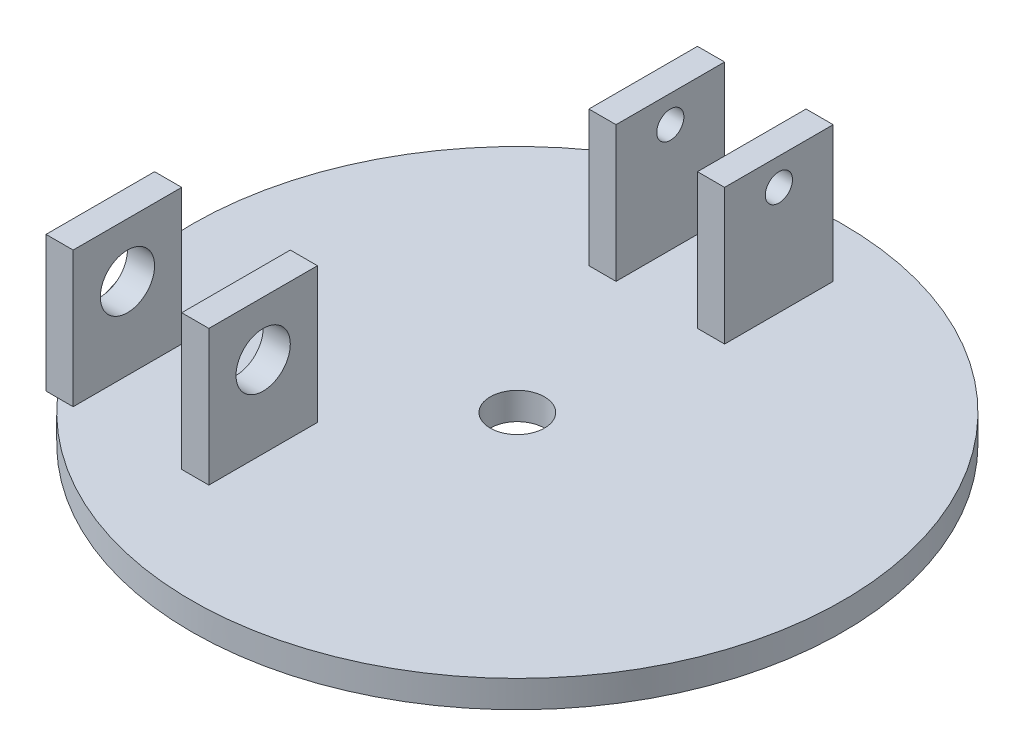
ISO-10303-21;
HEADER;
FILE_DESCRIPTION(('STEP AP214'),'2;1');
FILE_NAME('part.step','',(''),(''),'','','');
FILE_SCHEMA(('AUTOMOTIVE_DESIGN { 1 0 10303 214 1 1 1 1 }'));
ENDSEC;
DATA;
#1=APPLICATION_CONTEXT('core data for automotive mechanical design processes');
#2=APPLICATION_PROTOCOL_DEFINITION('international standard','automotive_design',2000,#1);
#3=PRODUCT_CONTEXT('',#1,'mechanical');
#4=PRODUCT('Part','Part','',(#3));
#5=PRODUCT_RELATED_PRODUCT_CATEGORY('part','',(#4));
#6=PRODUCT_DEFINITION_FORMATION('','',#4);
#7=PRODUCT_DEFINITION_CONTEXT('part definition',#1,'design');
#8=PRODUCT_DEFINITION('design','',#6,#7);
#9=PRODUCT_DEFINITION_SHAPE('','',#8);
#10=(LENGTH_UNIT() NAMED_UNIT(*) SI_UNIT(.MILLI.,.METRE.));
#11=(NAMED_UNIT(*) PLANE_ANGLE_UNIT() SI_UNIT($,.RADIAN.));
#12=(NAMED_UNIT(*) SI_UNIT($,.STERADIAN.) SOLID_ANGLE_UNIT());
#13=UNCERTAINTY_MEASURE_WITH_UNIT(LENGTH_MEASURE(1.E-05),#10,'distance_accuracy_value','');
#14=(GEOMETRIC_REPRESENTATION_CONTEXT(3) GLOBAL_UNCERTAINTY_ASSIGNED_CONTEXT((#13)) GLOBAL_UNIT_ASSIGNED_CONTEXT((#10,
#11,#12)) REPRESENTATION_CONTEXT('',''));
#15=CARTESIAN_POINT('',(0.,0.,0.));
#16=DIRECTION('',(0.,0.,1.));
#17=DIRECTION('',(1.,0.,0.));
#18=AXIS2_PLACEMENT_3D('',#15,#16,#17);
#19=CARTESIAN_POINT('',(0.,6.35,0.));
#20=DIRECTION('',(0.,1.,0.));
#21=DIRECTION('',(0.,0.,1.));
#22=AXIS2_PLACEMENT_3D('',#19,#20,#21);
#23=PLANE('',#22);
#24=DIRECTION('',(1.,0.,0.));
#25=VECTOR('',#24,1.);
#26=CARTESIAN_POINT('',(-21.36267,6.35,-38.1));
#27=LINE('',#26,#25);
#28=CARTESIAN_POINT('',(-21.36267,6.35,-38.1));
#29=VERTEX_POINT('',#28);
#30=CARTESIAN_POINT('',(-15.01267,6.35,-38.1));
#31=VERTEX_POINT('',#30);
#32=EDGE_CURVE('E184',#29,#31,#27,.T.);
#33=ORIENTED_EDGE('',*,*,#32,.F.);
#34=DIRECTION('',(0.,0.,1.));
#35=VECTOR('',#34,1.);
#36=CARTESIAN_POINT('',(-21.36267,6.35,-38.1));
#37=LINE('',#36,#35);
#38=CARTESIAN_POINT('',(-21.36267,6.35,-63.5));
#39=VERTEX_POINT('',#38);
#40=EDGE_CURVE('E181',#39,#29,#37,.T.);
#41=ORIENTED_EDGE('',*,*,#40,.F.);
#42=DIRECTION('',(-1.,0.,0.));
#43=VECTOR('',#42,1.);
#44=CARTESIAN_POINT('',(-21.36267,6.35,-63.5));
#45=LINE('',#44,#43);
#46=CARTESIAN_POINT('',(-15.01267,6.35,-63.5));
#47=VERTEX_POINT('',#46);
#48=EDGE_CURVE('E193',#47,#39,#45,.T.);
#49=ORIENTED_EDGE('',*,*,#48,.F.);
#50=DIRECTION('',(0.,0.,-1.));
#51=VECTOR('',#50,1.);
#52=CARTESIAN_POINT('',(-15.01267,6.35,-38.1));
#53=LINE('',#52,#51);
#54=EDGE_CURVE('E201',#31,#47,#53,.T.);
#55=ORIENTED_EDGE('',*,*,#54,.F.);
#56=EDGE_LOOP('',(#33,#41,#49,#55));
#57=FACE_BOUND('',#56,.T.);
#58=CARTESIAN_POINT('',(0.,6.35,0.));
#59=DIRECTION('',(0.,-1.,0.));
#60=DIRECTION('',(0.,0.,-1.));
#61=AXIS2_PLACEMENT_3D('',#58,#59,#60);
#62=CIRCLE('',#61,6.35);
#63=CARTESIAN_POINT('',(0.,6.35,-6.35));
#64=VERTEX_POINT('',#63);
#65=EDGE_CURVE('E286',#64,#64,#62,.T.);
#66=ORIENTED_EDGE('',*,*,#65,.T.);
#67=EDGE_LOOP('',(#66));
#68=FACE_BOUND('',#67,.T.);
#69=DIRECTION('',(0.,0.,1.));
#70=VECTOR('',#69,1.);
#71=CARTESIAN_POINT('',(-59.46267,6.35,25.4));
#72=LINE('',#71,#70);
#73=CARTESIAN_POINT('',(-59.46267,6.35,25.4));
#74=VERTEX_POINT('',#73);
#75=CARTESIAN_POINT('',(-59.46267,6.35,47.6511372001876));
#76=VERTEX_POINT('',#75);
#77=EDGE_CURVE('E265',#74,#76,#72,.T.);
#78=ORIENTED_EDGE('',*,*,#77,.F.);
#79=DIRECTION('',(-1.,0.,0.));
#80=VECTOR('',#79,1.);
#81=CARTESIAN_POINT('',(-59.46267,6.35,25.4));
#82=LINE('',#81,#80);
#83=CARTESIAN_POINT('',(-53.11267,6.35,25.4));
#84=VERTEX_POINT('',#83);
#85=EDGE_CURVE('E258',#84,#74,#82,.T.);
#86=ORIENTED_EDGE('',*,*,#85,.F.);
#87=DIRECTION('',(0.,0.,-1.));
#88=VECTOR('',#87,1.);
#89=CARTESIAN_POINT('',(-53.11267,6.35,25.4));
#90=LINE('',#89,#88);
#91=CARTESIAN_POINT('',(-53.11267,6.35,50.8));
#92=VERTEX_POINT('',#91);
#93=EDGE_CURVE('E269',#92,#84,#90,.T.);
#94=ORIENTED_EDGE('',*,*,#93,.F.);
#95=DIRECTION('',(1.,0.,0.));
#96=VECTOR('',#95,1.);
#97=CARTESIAN_POINT('',(-59.46267,6.35,50.8));
#98=LINE('',#97,#96);
#99=CARTESIAN_POINT('',(-56.7961266284947,6.35,50.8));
#100=VERTEX_POINT('',#99);
#101=EDGE_CURVE('E11',#100,#92,#98,.T.);
#102=ORIENTED_EDGE('',*,*,#101,.F.);
#103=CARTESIAN_POINT('',(0.,6.35,0.));
#104=DIRECTION('',(0.,1.,0.));
#105=DIRECTION('',(0.,0.,1.));
#106=AXIS2_PLACEMENT_3D('',#103,#104,#105);
#107=CIRCLE('',#106,76.2);
#108=EDGE_CURVE('E291',#100,#76,#107,.T.);
#109=ORIENTED_EDGE('',*,*,#108,.T.);
#110=EDGE_LOOP('',(#78,#86,#94,#102,#109));
#111=FACE_BOUND('',#110,.T.);
#112=DIRECTION('',(1.,0.,0.));
#113=VECTOR('',#112,1.);
#114=CARTESIAN_POINT('',(-27.71267,6.35,50.8));
#115=LINE('',#114,#113);
#116=CARTESIAN_POINT('',(-27.71267,6.35,50.8));
#117=VERTEX_POINT('',#116);
#118=CARTESIAN_POINT('',(-21.36267,6.35,50.8));
#119=VERTEX_POINT('',#118);
#120=EDGE_CURVE('E238',#117,#119,#115,.T.);
#121=ORIENTED_EDGE('',*,*,#120,.F.);
#122=DIRECTION('',(0.,0.,1.));
#123=VECTOR('',#122,1.);
#124=CARTESIAN_POINT('',(-27.71267,6.35,25.4));
#125=LINE('',#124,#123);
#126=CARTESIAN_POINT('',(-27.71267,6.35,25.4));
#127=VERTEX_POINT('',#126);
#128=EDGE_CURVE('E224',#127,#117,#125,.T.);
#129=ORIENTED_EDGE('',*,*,#128,.F.);
#130=DIRECTION('',(-1.,0.,0.));
#131=VECTOR('',#130,1.);
#132=CARTESIAN_POINT('',(-27.71267,6.35,25.4));
#133=LINE('',#132,#131);
#134=CARTESIAN_POINT('',(-21.36267,6.35,25.4));
#135=VERTEX_POINT('',#134);
#136=EDGE_CURVE('E229',#135,#127,#133,.T.);
#137=ORIENTED_EDGE('',*,*,#136,.F.);
#138=DIRECTION('',(0.,0.,-1.));
#139=VECTOR('',#138,1.);
#140=CARTESIAN_POINT('',(-21.36267,6.35,25.4));
#141=LINE('',#140,#139);
#142=EDGE_CURVE('E240',#119,#135,#141,.T.);
#143=ORIENTED_EDGE('',*,*,#142,.F.);
#144=EDGE_LOOP('',(#121,#129,#137,#143));
#145=FACE_BOUND('',#144,.T.);
#146=DIRECTION('',(1.,0.,0.));
#147=VECTOR('',#146,1.);
#148=CARTESIAN_POINT('',(4.03732999999998,6.35,-38.1));
#149=LINE('',#148,#147);
#150=CARTESIAN_POINT('',(4.03732999999998,6.35,-38.1));
#151=VERTEX_POINT('',#150);
#152=CARTESIAN_POINT('',(10.38733,6.35,-38.1));
#153=VERTEX_POINT('',#152);
#154=EDGE_CURVE('E422',#151,#153,#149,.T.);
#155=ORIENTED_EDGE('',*,*,#154,.F.);
#156=DIRECTION('',(0.,0.,1.));
#157=VECTOR('',#156,1.);
#158=CARTESIAN_POINT('',(4.03732999999998,6.35,-63.5));
#159=LINE('',#158,#157);
#160=CARTESIAN_POINT('',(4.03732999999998,6.35,-63.5));
#161=VERTEX_POINT('',#160);
#162=EDGE_CURVE('E179',#161,#151,#159,.T.);
#163=ORIENTED_EDGE('',*,*,#162,.F.);
#164=DIRECTION('',(-1.,0.,0.));
#165=VECTOR('',#164,1.);
#166=CARTESIAN_POINT('',(4.03732999999998,6.35,-63.5));
#167=LINE('',#166,#165);
#168=CARTESIAN_POINT('',(10.38733,6.35,-63.5));
#169=VERTEX_POINT('',#168);
#170=EDGE_CURVE('E175',#169,#161,#167,.T.);
#171=ORIENTED_EDGE('',*,*,#170,.F.);
#172=DIRECTION('',(0.,0.,-1.));
#173=VECTOR('',#172,1.);
#174=CARTESIAN_POINT('',(10.38733,6.35,-63.5));
#175=LINE('',#174,#173);
#176=EDGE_CURVE('E433',#153,#169,#175,.T.);
#177=ORIENTED_EDGE('',*,*,#176,.F.);
#178=EDGE_LOOP('',(#155,#163,#171,#177));
#179=FACE_BOUND('',#178,.T.);
#180=ADVANCED_FACE('F33',(#57,#68,#111,#145,#179),#23,.T.);
#181=CARTESIAN_POINT('',(0.,6.35,0.));
#182=DIRECTION('',(0.,-1.,0.));
#183=DIRECTION('',(0.,0.,-1.));
#184=AXIS2_PLACEMENT_3D('',#181,#182,#183);
#185=CYLINDRICAL_SURFACE('',#184,76.2);
#186=EDGE_CURVE('E42',#76,#100,#107,.T.);
#187=ORIENTED_EDGE('',*,*,#186,.F.);
#188=ORIENTED_EDGE('',*,*,#108,.F.);
#189=EDGE_LOOP('',(#187,#188));
#190=FACE_BOUND('',#189,.T.);
#191=CARTESIAN_POINT('',(0.,0.,0.));
#192=DIRECTION('',(0.,1.,0.));
#193=DIRECTION('',(0.,0.,1.));
#194=AXIS2_PLACEMENT_3D('',#191,#192,#193);
#195=CIRCLE('',#194,76.2);
#196=CARTESIAN_POINT('',(0.,0.,76.2));
#197=VERTEX_POINT('',#196);
#198=EDGE_CURVE('E37',#197,#197,#195,.T.);
#199=ORIENTED_EDGE('',*,*,#198,.T.);
#200=EDGE_LOOP('',(#199));
#201=FACE_BOUND('',#200,.T.);
#202=ADVANCED_FACE('F35',(#190,#201),#185,.T.);
#203=CARTESIAN_POINT('',(0.,0.,0.));
#204=DIRECTION('',(0.,1.,0.));
#205=DIRECTION('',(0.,0.,1.));
#206=AXIS2_PLACEMENT_3D('',#203,#204,#205);
#207=PLANE('',#206);
#208=CARTESIAN_POINT('',(0.,0.,0.));
#209=DIRECTION('',(0.,-1.,0.));
#210=DIRECTION('',(0.,0.,-1.));
#211=AXIS2_PLACEMENT_3D('',#208,#209,#210);
#212=CIRCLE('',#211,6.35);
#213=CARTESIAN_POINT('',(0.,0.,-6.35));
#214=VERTEX_POINT('',#213);
#215=EDGE_CURVE('E285',#214,#214,#212,.T.);
#216=ORIENTED_EDGE('',*,*,#215,.F.);
#217=EDGE_LOOP('',(#216));
#218=FACE_BOUND('',#217,.T.);
#219=ORIENTED_EDGE('',*,*,#198,.F.);
#220=EDGE_LOOP('',(#219));
#221=FACE_BOUND('',#220,.T.);
#222=ADVANCED_FACE('F302',(#218,#221),#207,.F.);
#223=CARTESIAN_POINT('',(0.,6.35,0.));
#224=DIRECTION('',(0.,-1.,0.));
#225=DIRECTION('',(0.,0.,-1.));
#226=AXIS2_PLACEMENT_3D('',#223,#224,#225);
#227=CYLINDRICAL_SURFACE('',#226,6.35);
#228=ORIENTED_EDGE('',*,*,#65,.F.);
#229=EDGE_LOOP('',(#228));
#230=FACE_BOUND('',#229,.T.);
#231=ORIENTED_EDGE('',*,*,#215,.T.);
#232=EDGE_LOOP('',(#231));
#233=FACE_BOUND('',#232,.T.);
#234=ADVANCED_FACE('F304',(#230,#233),#227,.F.);
#235=CARTESIAN_POINT('',(0.,6.35,0.));
#236=DIRECTION('',(0.,1.,0.));
#237=DIRECTION('',(0.,0.,1.));
#238=AXIS2_PLACEMENT_3D('',#235,#236,#237);
#239=PLANE('',#238);
#240=CARTESIAN_POINT('',(-59.46267,6.35,50.8));
#241=VERTEX_POINT('',#240);
#242=EDGE_CURVE('E253',#76,#241,#72,.T.);
#243=ORIENTED_EDGE('',*,*,#242,.F.);
#244=ORIENTED_EDGE('',*,*,#186,.T.);
#245=EDGE_CURVE('E44',#241,#100,#98,.T.);
#246=ORIENTED_EDGE('',*,*,#245,.F.);
#247=EDGE_LOOP('',(#243,#244,#246));
#248=FACE_BOUND('',#247,.T.);
#249=ADVANCED_FACE('F310',(#248),#239,.F.);
#250=CARTESIAN_POINT('',(-59.46267,38.1,25.4));
#251=DIRECTION('',(1.,0.,0.));
#252=DIRECTION('',(0.,0.,-1.));
#253=AXIS2_PLACEMENT_3D('',#250,#251,#252);
#254=PLANE('',#253);
#255=CARTESIAN_POINT('',(-59.46267,25.4,38.1));
#256=DIRECTION('',(1.,0.,0.));
#257=DIRECTION('',(0.,0.,-1.));
#258=AXIS2_PLACEMENT_3D('',#255,#256,#257);
#259=CIRCLE('',#258,6.35);
#260=CARTESIAN_POINT('',(-59.46267,25.4,31.75));
#261=VERTEX_POINT('',#260);
#262=EDGE_CURVE('E215',#261,#261,#259,.F.);
#263=ORIENTED_EDGE('',*,*,#262,.F.);
#264=EDGE_LOOP('',(#263));
#265=FACE_BOUND('',#264,.T.);
#266=ORIENTED_EDGE('',*,*,#77,.T.);
#267=ORIENTED_EDGE('',*,*,#242,.T.);
#268=DIRECTION('',(0.,-1.,0.));
#269=VECTOR('',#268,1.);
#270=CARTESIAN_POINT('',(-59.46267,38.1,50.8));
#271=LINE('',#270,#269);
#272=CARTESIAN_POINT('',(-59.46267,38.1,50.8));
#273=VERTEX_POINT('',#272);
#274=EDGE_CURVE('E282',#273,#241,#271,.T.);
#275=ORIENTED_EDGE('',*,*,#274,.F.);
#276=DIRECTION('',(0.,0.,1.));
#277=VECTOR('',#276,1.);
#278=CARTESIAN_POINT('',(-59.46267,38.1,25.4));
#279=LINE('',#278,#277);
#280=CARTESIAN_POINT('',(-59.46267,38.1,25.4));
#281=VERTEX_POINT('',#280);
#282=EDGE_CURVE('E254',#281,#273,#279,.T.);
#283=ORIENTED_EDGE('',*,*,#282,.F.);
#284=DIRECTION('',(0.,-1.,0.));
#285=VECTOR('',#284,1.);
#286=CARTESIAN_POINT('',(-59.46267,38.1,25.4));
#287=LINE('',#286,#285);
#288=EDGE_CURVE('E264',#281,#74,#287,.T.);
#289=ORIENTED_EDGE('',*,*,#288,.T.);
#290=EDGE_LOOP('',(#266,#267,#275,#283,#289));
#291=FACE_BOUND('',#290,.T.);
#292=ADVANCED_FACE('F325',(#265,#291),#254,.F.);
#293=CARTESIAN_POINT('',(-59.46267,38.1,50.8));
#294=DIRECTION('',(0.,0.,-1.));
#295=DIRECTION('',(-1.,0.,0.));
#296=AXIS2_PLACEMENT_3D('',#293,#294,#295);
#297=PLANE('',#296);
#298=ORIENTED_EDGE('',*,*,#245,.T.);
#299=ORIENTED_EDGE('',*,*,#101,.T.);
#300=DIRECTION('',(0.,-1.,0.));
#301=VECTOR('',#300,1.);
#302=CARTESIAN_POINT('',(-53.11267,38.1,50.8));
#303=LINE('',#302,#301);
#304=CARTESIAN_POINT('',(-53.11267,38.1,50.8));
#305=VERTEX_POINT('',#304);
#306=EDGE_CURVE('E279',#305,#92,#303,.T.);
#307=ORIENTED_EDGE('',*,*,#306,.F.);
#308=DIRECTION('',(1.,0.,0.));
#309=VECTOR('',#308,1.);
#310=CARTESIAN_POINT('',(-59.46267,38.1,50.8));
#311=LINE('',#310,#309);
#312=EDGE_CURVE('E257',#273,#305,#311,.T.);
#313=ORIENTED_EDGE('',*,*,#312,.F.);
#314=ORIENTED_EDGE('',*,*,#274,.T.);
#315=EDGE_LOOP('',(#298,#299,#307,#313,#314));
#316=FACE_BOUND('',#315,.T.);
#317=ADVANCED_FACE('F328',(#316),#297,.F.);
#318=CARTESIAN_POINT('',(-53.11267,38.1,25.4));
#319=DIRECTION('',(-1.,0.,0.));
#320=DIRECTION('',(0.,0.,1.));
#321=AXIS2_PLACEMENT_3D('',#318,#319,#320);
#322=PLANE('',#321);
#323=CARTESIAN_POINT('',(-53.11267,25.4,38.1));
#324=DIRECTION('',(-1.,0.,0.));
#325=DIRECTION('',(0.,0.,1.));
#326=AXIS2_PLACEMENT_3D('',#323,#324,#325);
#327=CIRCLE('',#326,6.35);
#328=CARTESIAN_POINT('',(-53.11267,25.4,44.45));
#329=VERTEX_POINT('',#328);
#330=EDGE_CURVE('E221',#329,#329,#327,.T.);
#331=ORIENTED_EDGE('',*,*,#330,.T.);
#332=EDGE_LOOP('',(#331));
#333=FACE_BOUND('',#332,.T.);
#334=ORIENTED_EDGE('',*,*,#93,.T.);
#335=DIRECTION('',(0.,-1.,0.));
#336=VECTOR('',#335,1.);
#337=CARTESIAN_POINT('',(-53.11267,38.1,25.4));
#338=LINE('',#337,#336);
#339=CARTESIAN_POINT('',(-53.11267,38.1,25.4));
#340=VERTEX_POINT('',#339);
#341=EDGE_CURVE('E276',#340,#84,#338,.T.);
#342=ORIENTED_EDGE('',*,*,#341,.F.);
#343=DIRECTION('',(0.,0.,-1.));
#344=VECTOR('',#343,1.);
#345=CARTESIAN_POINT('',(-53.11267,38.1,25.4));
#346=LINE('',#345,#344);
#347=EDGE_CURVE('E260',#305,#340,#346,.T.);
#348=ORIENTED_EDGE('',*,*,#347,.F.);
#349=ORIENTED_EDGE('',*,*,#306,.T.);
#350=EDGE_LOOP('',(#334,#342,#348,#349));
#351=FACE_BOUND('',#350,.T.);
#352=ADVANCED_FACE('F332',(#333,#351),#322,.F.);
#353=CARTESIAN_POINT('',(-59.46267,38.1,25.4));
#354=DIRECTION('',(0.,0.,1.));
#355=DIRECTION('',(1.,0.,0.));
#356=AXIS2_PLACEMENT_3D('',#353,#354,#355);
#357=PLANE('',#356);
#358=ORIENTED_EDGE('',*,*,#85,.T.);
#359=ORIENTED_EDGE('',*,*,#288,.F.);
#360=DIRECTION('',(-1.,0.,0.));
#361=VECTOR('',#360,1.);
#362=CARTESIAN_POINT('',(-59.46267,38.1,25.4));
#363=LINE('',#362,#361);
#364=EDGE_CURVE('E262',#340,#281,#363,.T.);
#365=ORIENTED_EDGE('',*,*,#364,.F.);
#366=ORIENTED_EDGE('',*,*,#341,.T.);
#367=EDGE_LOOP('',(#358,#359,#365,#366));
#368=FACE_BOUND('',#367,.T.);
#369=ADVANCED_FACE('F336',(#368),#357,.F.);
#370=CARTESIAN_POINT('',(0.,38.1,0.));
#371=DIRECTION('',(0.,1.,0.));
#372=DIRECTION('',(0.,0.,1.));
#373=AXIS2_PLACEMENT_3D('',#370,#371,#372);
#374=PLANE('',#373);
#375=ORIENTED_EDGE('',*,*,#282,.T.);
#376=ORIENTED_EDGE('',*,*,#312,.T.);
#377=ORIENTED_EDGE('',*,*,#347,.T.);
#378=ORIENTED_EDGE('',*,*,#364,.T.);
#379=EDGE_LOOP('',(#375,#376,#377,#378));
#380=FACE_BOUND('',#379,.T.);
#381=ADVANCED_FACE('F340',(#380),#374,.T.);
#382=CARTESIAN_POINT('',(-27.71267,38.1,25.4));
#383=DIRECTION('',(1.,0.,0.));
#384=DIRECTION('',(0.,0.,-1.));
#385=AXIS2_PLACEMENT_3D('',#382,#383,#384);
#386=PLANE('',#385);
#387=CARTESIAN_POINT('',(-27.71267,25.4,38.1));
#388=DIRECTION('',(1.,0.,0.));
#389=DIRECTION('',(0.,0.,-1.));
#390=AXIS2_PLACEMENT_3D('',#387,#388,#389);
#391=CIRCLE('',#390,6.35);
#392=CARTESIAN_POINT('',(-27.71267,25.4,31.75));
#393=VERTEX_POINT('',#392);
#394=EDGE_CURVE('E218',#393,#393,#391,.T.);
#395=ORIENTED_EDGE('',*,*,#394,.T.);
#396=EDGE_LOOP('',(#395));
#397=FACE_BOUND('',#396,.T.);
#398=ORIENTED_EDGE('',*,*,#128,.T.);
#399=DIRECTION('',(0.,-1.,0.));
#400=VECTOR('',#399,1.);
#401=CARTESIAN_POINT('',(-27.71267,38.1,50.8));
#402=LINE('',#401,#400);
#403=CARTESIAN_POINT('',(-27.71267,38.1,50.8));
#404=VERTEX_POINT('',#403);
#405=EDGE_CURVE('E251',#404,#117,#402,.T.);
#406=ORIENTED_EDGE('',*,*,#405,.F.);
#407=DIRECTION('',(0.,0.,1.));
#408=VECTOR('',#407,1.);
#409=CARTESIAN_POINT('',(-27.71267,38.1,25.4));
#410=LINE('',#409,#408);
#411=CARTESIAN_POINT('',(-27.71267,38.1,25.4));
#412=VERTEX_POINT('',#411);
#413=EDGE_CURVE('E225',#412,#404,#410,.T.);
#414=ORIENTED_EDGE('',*,*,#413,.F.);
#415=DIRECTION('',(0.,-1.,0.));
#416=VECTOR('',#415,1.);
#417=CARTESIAN_POINT('',(-27.71267,38.1,25.4));
#418=LINE('',#417,#416);
#419=EDGE_CURVE('E235',#412,#127,#418,.T.);
#420=ORIENTED_EDGE('',*,*,#419,.T.);
#421=EDGE_LOOP('',(#398,#406,#414,#420));
#422=FACE_BOUND('',#421,.T.);
#423=ADVANCED_FACE('F346',(#397,#422),#386,.F.);
#424=CARTESIAN_POINT('',(-27.71267,38.1,50.8));
#425=DIRECTION('',(0.,0.,-1.));
#426=DIRECTION('',(-1.,0.,0.));
#427=AXIS2_PLACEMENT_3D('',#424,#425,#426);
#428=PLANE('',#427);
#429=ORIENTED_EDGE('',*,*,#120,.T.);
#430=DIRECTION('',(0.,-1.,0.));
#431=VECTOR('',#430,1.);
#432=CARTESIAN_POINT('',(-21.36267,38.1,50.8));
#433=LINE('',#432,#431);
#434=CARTESIAN_POINT('',(-21.36267,38.1,50.8));
#435=VERTEX_POINT('',#434);
#436=EDGE_CURVE('E248',#435,#119,#433,.T.);
#437=ORIENTED_EDGE('',*,*,#436,.F.);
#438=DIRECTION('',(1.,0.,0.));
#439=VECTOR('',#438,1.);
#440=CARTESIAN_POINT('',(-27.71267,38.1,50.8));
#441=LINE('',#440,#439);
#442=EDGE_CURVE('E228',#404,#435,#441,.T.);
#443=ORIENTED_EDGE('',*,*,#442,.F.);
#444=ORIENTED_EDGE('',*,*,#405,.T.);
#445=EDGE_LOOP('',(#429,#437,#443,#444));
#446=FACE_BOUND('',#445,.T.);
#447=ADVANCED_FACE('F350',(#446),#428,.F.);
#448=CARTESIAN_POINT('',(-21.36267,38.1,25.4));
#449=DIRECTION('',(-1.,0.,0.));
#450=DIRECTION('',(0.,0.,1.));
#451=AXIS2_PLACEMENT_3D('',#448,#449,#450);
#452=PLANE('',#451);
#453=CARTESIAN_POINT('',(-21.36267,25.4,38.1));
#454=DIRECTION('',(1.,0.,0.));
#455=DIRECTION('',(0.,0.,-1.));
#456=AXIS2_PLACEMENT_3D('',#453,#454,#455);
#457=CIRCLE('',#456,6.35);
#458=CARTESIAN_POINT('',(-21.36267,25.4,31.75));
#459=VERTEX_POINT('',#458);
#460=EDGE_CURVE('E212',#459,#459,#457,.T.);
#461=ORIENTED_EDGE('',*,*,#460,.F.);
#462=EDGE_LOOP('',(#461));
#463=FACE_BOUND('',#462,.T.);
#464=ORIENTED_EDGE('',*,*,#142,.T.);
#465=DIRECTION('',(0.,-1.,0.));
#466=VECTOR('',#465,1.);
#467=CARTESIAN_POINT('',(-21.36267,38.1,25.4));
#468=LINE('',#467,#466);
#469=CARTESIAN_POINT('',(-21.36267,38.1,25.4));
#470=VERTEX_POINT('',#469);
#471=EDGE_CURVE('E246',#470,#135,#468,.T.);
#472=ORIENTED_EDGE('',*,*,#471,.F.);
#473=DIRECTION('',(0.,0.,-1.));
#474=VECTOR('',#473,1.);
#475=CARTESIAN_POINT('',(-21.36267,38.1,25.4));
#476=LINE('',#475,#474);
#477=EDGE_CURVE('E231',#435,#470,#476,.T.);
#478=ORIENTED_EDGE('',*,*,#477,.F.);
#479=ORIENTED_EDGE('',*,*,#436,.T.);
#480=EDGE_LOOP('',(#464,#472,#478,#479));
#481=FACE_BOUND('',#480,.T.);
#482=ADVANCED_FACE('F354',(#463,#481),#452,.F.);
#483=CARTESIAN_POINT('',(-27.71267,38.1,25.4));
#484=DIRECTION('',(0.,0.,1.));
#485=DIRECTION('',(1.,0.,0.));
#486=AXIS2_PLACEMENT_3D('',#483,#484,#485);
#487=PLANE('',#486);
#488=ORIENTED_EDGE('',*,*,#136,.T.);
#489=ORIENTED_EDGE('',*,*,#419,.F.);
#490=DIRECTION('',(-1.,0.,0.));
#491=VECTOR('',#490,1.);
#492=CARTESIAN_POINT('',(-27.71267,38.1,25.4));
#493=LINE('',#492,#491);
#494=EDGE_CURVE('E233',#470,#412,#493,.T.);
#495=ORIENTED_EDGE('',*,*,#494,.F.);
#496=ORIENTED_EDGE('',*,*,#471,.T.);
#497=EDGE_LOOP('',(#488,#489,#495,#496));
#498=FACE_BOUND('',#497,.T.);
#499=ADVANCED_FACE('F358',(#498),#487,.F.);
#500=CARTESIAN_POINT('',(0.,38.1,0.));
#501=DIRECTION('',(0.,1.,0.));
#502=DIRECTION('',(0.,0.,1.));
#503=AXIS2_PLACEMENT_3D('',#500,#501,#502);
#504=PLANE('',#503);
#505=ORIENTED_EDGE('',*,*,#413,.T.);
#506=ORIENTED_EDGE('',*,*,#442,.T.);
#507=ORIENTED_EDGE('',*,*,#477,.T.);
#508=ORIENTED_EDGE('',*,*,#494,.T.);
#509=EDGE_LOOP('',(#505,#506,#507,#508));
#510=FACE_BOUND('',#509,.T.);
#511=ADVANCED_FACE('F362',(#510),#504,.T.);
#512=CARTESIAN_POINT('',(-77.4231822421383,25.4,38.1));
#513=DIRECTION('',(1.,0.,0.));
#514=DIRECTION('',(0.,0.,-1.));
#515=AXIS2_PLACEMENT_3D('',#512,#513,#514);
#516=CYLINDRICAL_SURFACE('',#515,6.35);
#517=ORIENTED_EDGE('',*,*,#460,.T.);
#518=EDGE_LOOP('',(#517));
#519=FACE_BOUND('',#518,.T.);
#520=ORIENTED_EDGE('',*,*,#394,.F.);
#521=EDGE_LOOP('',(#520));
#522=FACE_BOUND('',#521,.T.);
#523=ADVANCED_FACE('F366',(#519,#522),#516,.F.);
#524=ORIENTED_EDGE('',*,*,#262,.T.);
#525=EDGE_LOOP('',(#524));
#526=FACE_BOUND('',#525,.T.);
#527=ORIENTED_EDGE('',*,*,#330,.F.);
#528=EDGE_LOOP('',(#527));
#529=FACE_BOUND('',#528,.T.);
#530=ADVANCED_FACE('F368',(#526,#529),#516,.F.);
#531=CARTESIAN_POINT('',(-21.36267,38.1,-38.1));
#532=DIRECTION('',(1.,0.,0.));
#533=DIRECTION('',(0.,0.,-1.));
#534=AXIS2_PLACEMENT_3D('',#531,#532,#533);
#535=PLANE('',#534);
#536=CARTESIAN_POINT('',(-21.36267,31.75,-50.8));
#537=DIRECTION('',(-1.,0.,0.));
#538=DIRECTION('',(0.,0.,1.));
#539=AXIS2_PLACEMENT_3D('',#536,#537,#538);
#540=CIRCLE('',#539,3.175);
#541=CARTESIAN_POINT('',(-21.36267,31.75,-47.625));
#542=VERTEX_POINT('',#541);
#543=EDGE_CURVE('E416',#542,#542,#540,.T.);
#544=ORIENTED_EDGE('',*,*,#543,.F.);
#545=EDGE_LOOP('',(#544));
#546=FACE_BOUND('',#545,.T.);
#547=ORIENTED_EDGE('',*,*,#40,.T.);
#548=DIRECTION('',(0.,-1.,0.));
#549=VECTOR('',#548,1.);
#550=CARTESIAN_POINT('',(-21.36267,38.1,-38.1));
#551=LINE('',#550,#549);
#552=CARTESIAN_POINT('',(-21.36267,38.1,-38.1));
#553=VERTEX_POINT('',#552);
#554=EDGE_CURVE('E210',#553,#29,#551,.T.);
#555=ORIENTED_EDGE('',*,*,#554,.F.);
#556=DIRECTION('',(0.,0.,1.));
#557=VECTOR('',#556,1.);
#558=CARTESIAN_POINT('',(-21.36267,38.1,-38.1));
#559=LINE('',#558,#557);
#560=CARTESIAN_POINT('',(-21.36267,38.1,-63.5));
#561=VERTEX_POINT('',#560);
#562=EDGE_CURVE('E189',#561,#553,#559,.T.);
#563=ORIENTED_EDGE('',*,*,#562,.F.);
#564=DIRECTION('',(0.,-1.,0.));
#565=VECTOR('',#564,1.);
#566=CARTESIAN_POINT('',(-21.36267,38.1,-63.5));
#567=LINE('',#566,#565);
#568=EDGE_CURVE('E198',#561,#39,#567,.T.);
#569=ORIENTED_EDGE('',*,*,#568,.T.);
#570=EDGE_LOOP('',(#547,#555,#563,#569));
#571=FACE_BOUND('',#570,.T.);
#572=ADVANCED_FACE('F371',(#546,#571),#535,.F.);
#573=CARTESIAN_POINT('',(-21.36267,38.1,-38.1));
#574=DIRECTION('',(0.,0.,-1.));
#575=DIRECTION('',(-1.,0.,0.));
#576=AXIS2_PLACEMENT_3D('',#573,#574,#575);
#577=PLANE('',#576);
#578=ORIENTED_EDGE('',*,*,#32,.T.);
#579=DIRECTION('',(0.,-1.,0.));
#580=VECTOR('',#579,1.);
#581=CARTESIAN_POINT('',(-15.01267,38.1,-38.1));
#582=LINE('',#581,#580);
#583=CARTESIAN_POINT('',(-15.01267,38.1,-38.1));
#584=VERTEX_POINT('',#583);
#585=EDGE_CURVE('E207',#584,#31,#582,.T.);
#586=ORIENTED_EDGE('',*,*,#585,.F.);
#587=DIRECTION('',(1.,0.,0.));
#588=VECTOR('',#587,1.);
#589=CARTESIAN_POINT('',(-21.36267,38.1,-38.1));
#590=LINE('',#589,#588);
#591=EDGE_CURVE('E192',#553,#584,#590,.T.);
#592=ORIENTED_EDGE('',*,*,#591,.F.);
#593=ORIENTED_EDGE('',*,*,#554,.T.);
#594=EDGE_LOOP('',(#578,#586,#592,#593));
#595=FACE_BOUND('',#594,.T.);
#596=ADVANCED_FACE('F375',(#595),#577,.F.);
#597=CARTESIAN_POINT('',(-15.01267,38.1,-38.1));
#598=DIRECTION('',(-1.,0.,0.));
#599=DIRECTION('',(0.,0.,1.));
#600=AXIS2_PLACEMENT_3D('',#597,#598,#599);
#601=PLANE('',#600);
#602=CARTESIAN_POINT('',(-15.01267,31.75,-50.8));
#603=DIRECTION('',(-1.,0.,0.));
#604=DIRECTION('',(0.,0.,1.));
#605=AXIS2_PLACEMENT_3D('',#602,#603,#604);
#606=CIRCLE('',#605,3.175);
#607=CARTESIAN_POINT('',(-15.01267,31.75,-47.625));
#608=VERTEX_POINT('',#607);
#609=EDGE_CURVE('E419',#608,#608,#606,.T.);
#610=ORIENTED_EDGE('',*,*,#609,.T.);
#611=EDGE_LOOP('',(#610));
#612=FACE_BOUND('',#611,.T.);
#613=ORIENTED_EDGE('',*,*,#54,.T.);
#614=DIRECTION('',(0.,-1.,0.));
#615=VECTOR('',#614,1.);
#616=CARTESIAN_POINT('',(-15.01267,38.1,-63.5));
#617=LINE('',#616,#615);
#618=CARTESIAN_POINT('',(-15.01267,38.1,-63.5));
#619=VERTEX_POINT('',#618);
#620=EDGE_CURVE('E59',#619,#47,#617,.T.);
#621=ORIENTED_EDGE('',*,*,#620,.F.);
#622=DIRECTION('',(0.,0.,-1.));
#623=VECTOR('',#622,1.);
#624=CARTESIAN_POINT('',(-15.01267,38.1,-38.1));
#625=LINE('',#624,#623);
#626=EDGE_CURVE('E195',#584,#619,#625,.T.);
#627=ORIENTED_EDGE('',*,*,#626,.F.);
#628=ORIENTED_EDGE('',*,*,#585,.T.);
#629=EDGE_LOOP('',(#613,#621,#627,#628));
#630=FACE_BOUND('',#629,.T.);
#631=ADVANCED_FACE('F379',(#612,#630),#601,.F.);
#632=CARTESIAN_POINT('',(-21.36267,38.1,-63.5));
#633=DIRECTION('',(0.,0.,1.));
#634=DIRECTION('',(1.,0.,0.));
#635=AXIS2_PLACEMENT_3D('',#632,#633,#634);
#636=PLANE('',#635);
#637=ORIENTED_EDGE('',*,*,#48,.T.);
#638=ORIENTED_EDGE('',*,*,#568,.F.);
#639=DIRECTION('',(-1.,0.,0.));
#640=VECTOR('',#639,1.);
#641=CARTESIAN_POINT('',(-21.36267,38.1,-63.5));
#642=LINE('',#641,#640);
#643=EDGE_CURVE('E197',#619,#561,#642,.T.);
#644=ORIENTED_EDGE('',*,*,#643,.F.);
#645=ORIENTED_EDGE('',*,*,#620,.T.);
#646=EDGE_LOOP('',(#637,#638,#644,#645));
#647=FACE_BOUND('',#646,.T.);
#648=ADVANCED_FACE('F383',(#647),#636,.F.);
#649=CARTESIAN_POINT('',(0.,38.1,0.));
#650=DIRECTION('',(0.,-1.,0.));
#651=DIRECTION('',(0.,0.,-1.));
#652=AXIS2_PLACEMENT_3D('',#649,#650,#651);
#653=PLANE('',#652);
#654=ORIENTED_EDGE('',*,*,#562,.T.);
#655=ORIENTED_EDGE('',*,*,#591,.T.);
#656=ORIENTED_EDGE('',*,*,#626,.T.);
#657=ORIENTED_EDGE('',*,*,#643,.T.);
#658=EDGE_LOOP('',(#654,#655,#656,#657));
#659=FACE_BOUND('',#658,.T.);
#660=ADVANCED_FACE('F387',(#659),#653,.F.);
#661=CARTESIAN_POINT('',(4.03732999999998,38.1,-63.5));
#662=DIRECTION('',(1.,0.,0.));
#663=DIRECTION('',(0.,0.,-1.));
#664=AXIS2_PLACEMENT_3D('',#661,#662,#663);
#665=PLANE('',#664);
#666=CARTESIAN_POINT('',(4.03732999999998,31.75,-50.8));
#667=DIRECTION('',(1.,0.,0.));
#668=DIRECTION('',(0.,0.,-1.));
#669=AXIS2_PLACEMENT_3D('',#666,#667,#668);
#670=CIRCLE('',#669,3.175);
#671=CARTESIAN_POINT('',(4.03732999999998,31.75,-53.975));
#672=VERTEX_POINT('',#671);
#673=EDGE_CURVE('E420',#672,#672,#670,.T.);
#674=ORIENTED_EDGE('',*,*,#673,.T.);
#675=EDGE_LOOP('',(#674));
#676=FACE_BOUND('',#675,.T.);
#677=ORIENTED_EDGE('',*,*,#162,.T.);
#678=DIRECTION('',(0.,-1.,0.));
#679=VECTOR('',#678,1.);
#680=CARTESIAN_POINT('',(4.03732999999998,38.1,-38.1));
#681=LINE('',#680,#679);
#682=CARTESIAN_POINT('',(4.03732999999998,38.1,-38.1));
#683=VERTEX_POINT('',#682);
#684=EDGE_CURVE('E160',#683,#151,#681,.T.);
#685=ORIENTED_EDGE('',*,*,#684,.F.);
#686=DIRECTION('',(0.,0.,1.));
#687=VECTOR('',#686,1.);
#688=CARTESIAN_POINT('',(4.03732999999998,38.1,-63.5));
#689=LINE('',#688,#687);
#690=CARTESIAN_POINT('',(4.03732999999998,38.1,-63.5));
#691=VERTEX_POINT('',#690);
#692=EDGE_CURVE('E167',#691,#683,#689,.T.);
#693=ORIENTED_EDGE('',*,*,#692,.F.);
#694=DIRECTION('',(0.,-1.,0.));
#695=VECTOR('',#694,1.);
#696=CARTESIAN_POINT('',(4.03732999999998,38.1,-63.5));
#697=LINE('',#696,#695);
#698=EDGE_CURVE('E430',#691,#161,#697,.T.);
#699=ORIENTED_EDGE('',*,*,#698,.T.);
#700=EDGE_LOOP('',(#677,#685,#693,#699));
#701=FACE_BOUND('',#700,.T.);
#702=ADVANCED_FACE('F177',(#676,#701),#665,.F.);
#703=CARTESIAN_POINT('',(4.03732999999998,38.1,-38.1));
#704=DIRECTION('',(0.,0.,-1.));
#705=DIRECTION('',(-1.,0.,0.));
#706=AXIS2_PLACEMENT_3D('',#703,#704,#705);
#707=PLANE('',#706);
#708=ORIENTED_EDGE('',*,*,#154,.T.);
#709=DIRECTION('',(0.,-1.,0.));
#710=VECTOR('',#709,1.);
#711=CARTESIAN_POINT('',(10.38733,38.1,-38.1));
#712=LINE('',#711,#710);
#713=CARTESIAN_POINT('',(10.38733,38.1,-38.1));
#714=VERTEX_POINT('',#713);
#715=EDGE_CURVE('E163',#714,#153,#712,.T.);
#716=ORIENTED_EDGE('',*,*,#715,.F.);
#717=DIRECTION('',(1.,0.,0.));
#718=VECTOR('',#717,1.);
#719=CARTESIAN_POINT('',(4.03732999999998,38.1,-38.1));
#720=LINE('',#719,#718);
#721=EDGE_CURVE('E156',#683,#714,#720,.T.);
#722=ORIENTED_EDGE('',*,*,#721,.F.);
#723=ORIENTED_EDGE('',*,*,#684,.T.);
#724=EDGE_LOOP('',(#708,#716,#722,#723));
#725=FACE_BOUND('',#724,.T.);
#726=ADVANCED_FACE('F158',(#725),#707,.F.);
#727=CARTESIAN_POINT('',(10.38733,38.1,-63.5));
#728=DIRECTION('',(-1.,0.,0.));
#729=DIRECTION('',(0.,0.,1.));
#730=AXIS2_PLACEMENT_3D('',#727,#728,#729);
#731=PLANE('',#730);
#732=CARTESIAN_POINT('',(10.38733,31.75,-50.8));
#733=DIRECTION('',(-1.,0.,0.));
#734=DIRECTION('',(0.,0.,1.));
#735=AXIS2_PLACEMENT_3D('',#732,#733,#734);
#736=CIRCLE('',#735,3.175);
#737=CARTESIAN_POINT('',(10.38733,31.75,-47.625));
#738=VERTEX_POINT('',#737);
#739=EDGE_CURVE('E425',#738,#738,#736,.F.);
#740=ORIENTED_EDGE('',*,*,#739,.F.);
#741=EDGE_LOOP('',(#740));
#742=FACE_BOUND('',#741,.T.);
#743=ORIENTED_EDGE('',*,*,#176,.T.);
#744=DIRECTION('',(0.,-1.,0.));
#745=VECTOR('',#744,1.);
#746=CARTESIAN_POINT('',(10.38733,38.1,-63.5));
#747=LINE('',#746,#745);
#748=CARTESIAN_POINT('',(10.38733,38.1,-63.5));
#749=VERTEX_POINT('',#748);
#750=EDGE_CURVE('E51',#749,#169,#747,.T.);
#751=ORIENTED_EDGE('',*,*,#750,.F.);
#752=DIRECTION('',(0.,0.,-1.));
#753=VECTOR('',#752,1.);
#754=CARTESIAN_POINT('',(10.38733,38.1,-63.5));
#755=LINE('',#754,#753);
#756=EDGE_CURVE('E166',#714,#749,#755,.T.);
#757=ORIENTED_EDGE('',*,*,#756,.F.);
#758=ORIENTED_EDGE('',*,*,#715,.T.);
#759=EDGE_LOOP('',(#743,#751,#757,#758));
#760=FACE_BOUND('',#759,.T.);
#761=ADVANCED_FACE('F396',(#742,#760),#731,.F.);
#762=CARTESIAN_POINT('',(4.03732999999998,38.1,-63.5));
#763=DIRECTION('',(0.,0.,1.));
#764=DIRECTION('',(1.,0.,0.));
#765=AXIS2_PLACEMENT_3D('',#762,#763,#764);
#766=PLANE('',#765);
#767=ORIENTED_EDGE('',*,*,#170,.T.);
#768=ORIENTED_EDGE('',*,*,#698,.F.);
#769=DIRECTION('',(-1.,0.,0.));
#770=VECTOR('',#769,1.);
#771=CARTESIAN_POINT('',(4.03732999999998,38.1,-63.5));
#772=LINE('',#771,#770);
#773=EDGE_CURVE('E171',#749,#691,#772,.T.);
#774=ORIENTED_EDGE('',*,*,#773,.F.);
#775=ORIENTED_EDGE('',*,*,#750,.T.);
#776=EDGE_LOOP('',(#767,#768,#774,#775));
#777=FACE_BOUND('',#776,.T.);
#778=ADVANCED_FACE('F399',(#777),#766,.F.);
#779=CARTESIAN_POINT('',(0.,38.1,0.));
#780=DIRECTION('',(0.,1.,0.));
#781=DIRECTION('',(0.,0.,1.));
#782=AXIS2_PLACEMENT_3D('',#779,#780,#781);
#783=PLANE('',#782);
#784=ORIENTED_EDGE('',*,*,#692,.T.);
#785=ORIENTED_EDGE('',*,*,#721,.T.);
#786=ORIENTED_EDGE('',*,*,#756,.T.);
#787=ORIENTED_EDGE('',*,*,#773,.T.);
#788=EDGE_LOOP('',(#784,#785,#786,#787));
#789=FACE_BOUND('',#788,.T.);
#790=ADVANCED_FACE('F170',(#789),#783,.T.);
#791=CARTESIAN_POINT('',(19.3675861210691,31.75,-50.8));
#792=DIRECTION('',(-1.,0.,0.));
#793=DIRECTION('',(0.,0.,1.));
#794=AXIS2_PLACEMENT_3D('',#791,#792,#793);
#795=CYLINDRICAL_SURFACE('',#794,3.175);
#796=ORIENTED_EDGE('',*,*,#739,.T.);
#797=EDGE_LOOP('',(#796));
#798=FACE_BOUND('',#797,.T.);
#799=ORIENTED_EDGE('',*,*,#673,.F.);
#800=EDGE_LOOP('',(#799));
#801=FACE_BOUND('',#800,.T.);
#802=ADVANCED_FACE('F405',(#798,#801),#795,.F.);
#803=ORIENTED_EDGE('',*,*,#543,.T.);
#804=EDGE_LOOP('',(#803));
#805=FACE_BOUND('',#804,.T.);
#806=ORIENTED_EDGE('',*,*,#609,.F.);
#807=EDGE_LOOP('',(#806));
#808=FACE_BOUND('',#807,.T.);
#809=ADVANCED_FACE('F406',(#805,#808),#795,.F.);
#810=CLOSED_SHELL('',(#180,#202,#222,#234,#249,#292,#317,#352,#369,#381,#423,#447,#482,#499,
#511,#523,#530,#572,#596,#631,#648,#660,#702,#726,#761,#778,#790,#802,#809));
#811=MANIFOLD_SOLID_BREP('B2',#810);
#812=ADVANCED_BREP_SHAPE_REPRESENTATION('',(#18,#811),#14);
#813=SHAPE_DEFINITION_REPRESENTATION(#9,#812);
ENDSEC;
END-ISO-10303-21;
